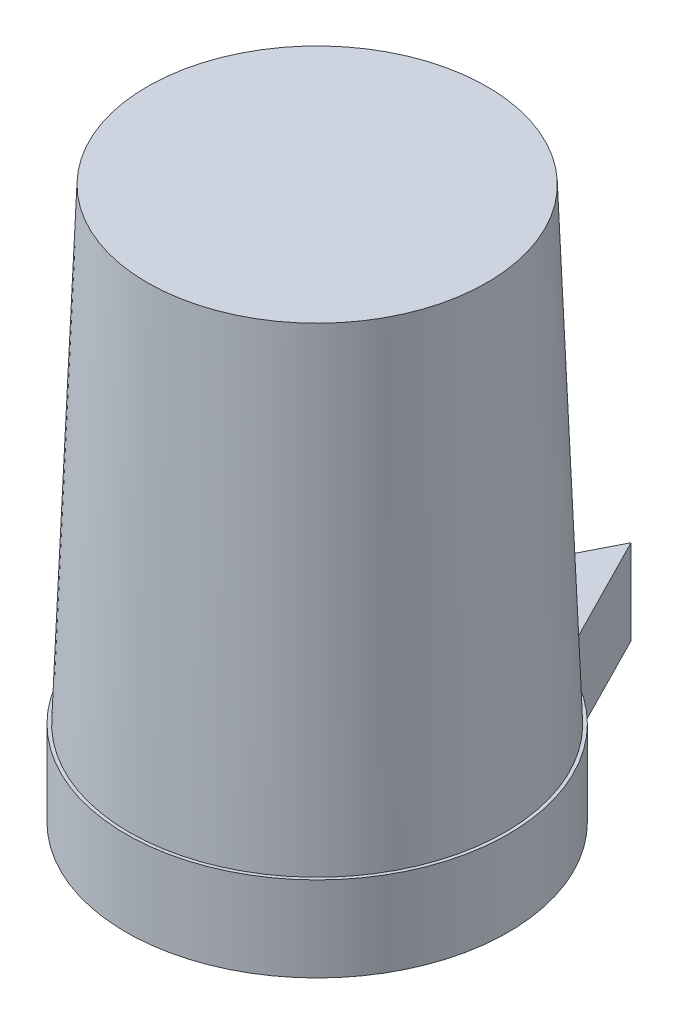
ISO-10303-21;
HEADER;
FILE_DESCRIPTION(('STEP AP214'),'2;1');
FILE_NAME('part.step','',(''),(''),'','','');
FILE_SCHEMA(('AUTOMOTIVE_DESIGN { 1 0 10303 214 1 1 1 1 }'));
ENDSEC;
DATA;
#1=APPLICATION_CONTEXT('core data for automotive mechanical design processes');
#2=APPLICATION_PROTOCOL_DEFINITION('international standard','automotive_design',2000,#1);
#3=PRODUCT_CONTEXT('',#1,'mechanical');
#4=PRODUCT('Part','Part','',(#3));
#5=PRODUCT_RELATED_PRODUCT_CATEGORY('part','',(#4));
#6=PRODUCT_DEFINITION_FORMATION('','',#4);
#7=PRODUCT_DEFINITION_CONTEXT('part definition',#1,'design');
#8=PRODUCT_DEFINITION('design','',#6,#7);
#9=PRODUCT_DEFINITION_SHAPE('','',#8);
#10=(LENGTH_UNIT() NAMED_UNIT(*) SI_UNIT(.MILLI.,.METRE.));
#11=(NAMED_UNIT(*) PLANE_ANGLE_UNIT() SI_UNIT($,.RADIAN.));
#12=(NAMED_UNIT(*) SI_UNIT($,.STERADIAN.) SOLID_ANGLE_UNIT());
#13=UNCERTAINTY_MEASURE_WITH_UNIT(LENGTH_MEASURE(1.E-05),#10,'distance_accuracy_value','');
#14=(GEOMETRIC_REPRESENTATION_CONTEXT(3) GLOBAL_UNCERTAINTY_ASSIGNED_CONTEXT((#13)) GLOBAL_UNIT_ASSIGNED_CONTEXT((#10,
#11,#12)) REPRESENTATION_CONTEXT('',''));
#15=CARTESIAN_POINT('',(0.,0.,0.));
#16=DIRECTION('',(0.,0.,1.));
#17=DIRECTION('',(1.,0.,0.));
#18=AXIS2_PLACEMENT_3D('',#15,#16,#17);
#19=CARTESIAN_POINT('',(0.,0.,0.));
#20=DIRECTION('',(0.,1.,0.));
#21=DIRECTION('',(0.,0.,1.));
#22=AXIS2_PLACEMENT_3D('',#19,#20,#21);
#23=PLANE('',#22);
#24=DIRECTION('',(1.,0.,0.));
#25=VECTOR('',#24,1.);
#26=CARTESIAN_POINT('',(0.,0.,-0.4));
#27=LINE('',#26,#25);
#28=CARTESIAN_POINT('',(-3.47706773014274,0.,-0.4));
#29=VERTEX_POINT('',#28);
#30=CARTESIAN_POINT('',(3.47706773014274,0.,-0.4));
#31=VERTEX_POINT('',#30);
#32=EDGE_CURVE('E61',#29,#31,#27,.T.);
#33=ORIENTED_EDGE('',*,*,#32,.T.);
#34=CARTESIAN_POINT('',(0.,0.,0.));
#35=DIRECTION('',(0.,1.,0.));
#36=DIRECTION('',(0.,0.,1.));
#37=AXIS2_PLACEMENT_3D('',#34,#35,#36);
#38=CIRCLE('',#37,3.5);
#39=EDGE_CURVE('E125',#31,#29,#38,.T.);
#40=ORIENTED_EDGE('',*,*,#39,.T.);
#41=EDGE_LOOP('',(#33,#40));
#42=FACE_BOUND('',#41,.T.);
#43=CARTESIAN_POINT('',(0.,0.,0.));
#44=DIRECTION('',(0.,1.,0.));
#45=DIRECTION('',(0.,0.,1.));
#46=AXIS2_PLACEMENT_3D('',#43,#44,#45);
#47=CIRCLE('',#46,4.5);
#48=CARTESIAN_POINT('',(-1.62629018955969,0.,-4.19585639399889));
#49=VERTEX_POINT('',#48);
#50=CARTESIAN_POINT('',(1.62628895832611,0.,-4.19585321764556));
#51=VERTEX_POINT('',#50);
#52=EDGE_CURVE('E151',#49,#51,#47,.T.);
#53=ORIENTED_EDGE('',*,*,#52,.F.);
#54=DIRECTION('',(0.453423096994453,0.,-0.891295402833404));
#55=VECTOR('',#54,1.);
#56=CARTESIAN_POINT('',(-2.98762275423245,0.,-1.51987450801244));
#57=LINE('',#56,#55);
#58=CARTESIAN_POINT('',(0.,0.,-7.39265523731092));
#59=VERTEX_POINT('',#58);
#60=EDGE_CURVE('E106',#49,#59,#57,.T.);
#61=ORIENTED_EDGE('',*,*,#60,.T.);
#62=DIRECTION('',(-0.453423096994453,0.,-0.891295402833404));
#63=VECTOR('',#62,1.);
#64=CARTESIAN_POINT('',(2.98762275423245,0.,-1.51987450801244));
#65=LINE('',#64,#63);
#66=EDGE_CURVE('E137',#51,#59,#65,.T.);
#67=ORIENTED_EDGE('',*,*,#66,.F.);
#68=EDGE_LOOP('',(#53,#61,#67));
#69=FACE_BOUND('',#68,.T.);
#70=CARTESIAN_POINT('',(0.,0.,0.));
#71=DIRECTION('',(0.,1.,0.));
#72=DIRECTION('',(0.,0.,1.));
#73=AXIS2_PLACEMENT_3D('',#70,#71,#72);
#74=CIRCLE('',#73,3.5);
#75=CARTESIAN_POINT('',(-3.47706773014274,0.,0.4));
#76=VERTEX_POINT('',#75);
#77=CARTESIAN_POINT('',(3.47706773014274,0.,0.4));
#78=VERTEX_POINT('',#77);
#79=EDGE_CURVE('E104',#76,#78,#74,.T.);
#80=ORIENTED_EDGE('',*,*,#79,.T.);
#81=DIRECTION('',(1.,0.,0.));
#82=VECTOR('',#81,1.);
#83=CARTESIAN_POINT('',(0.,0.,0.4));
#84=LINE('',#83,#82);
#85=EDGE_CURVE('E53',#76,#78,#84,.T.);
#86=ORIENTED_EDGE('',*,*,#85,.F.);
#87=EDGE_LOOP('',(#80,#86));
#88=FACE_BOUND('',#87,.T.);
#89=ADVANCED_FACE('F37',(#42,#69,#88),#23,.F.);
#90=CARTESIAN_POINT('',(0.,13.,0.));
#91=DIRECTION('',(0.,1.,0.));
#92=DIRECTION('',(0.,0.,1.));
#93=AXIS2_PLACEMENT_3D('',#90,#91,#92);
#94=PLANE('',#93);
#95=CARTESIAN_POINT('',(0.,13.,0.));
#96=DIRECTION('',(0.,1.,0.));
#97=DIRECTION('',(0.,0.,1.));
#98=AXIS2_PLACEMENT_3D('',#95,#96,#97);
#99=CIRCLE('',#98,4.);
#100=CARTESIAN_POINT('',(0.,13.,4.));
#101=VERTEX_POINT('',#100);
#102=EDGE_CURVE('E45',#101,#101,#99,.T.);
#103=ORIENTED_EDGE('',*,*,#102,.T.);
#104=EDGE_LOOP('',(#103));
#105=FACE_BOUND('',#104,.T.);
#106=ADVANCED_FACE('F180',(#105),#94,.T.);
#107=CARTESIAN_POINT('',(0.,13.,0.));
#108=DIRECTION('',(0.,-1.,0.));
#109=DIRECTION('',(0.,0.,-1.));
#110=AXIS2_PLACEMENT_3D('',#107,#108,#109);
#111=CONICAL_SURFACE('',#110,4.,0.038442590021188);
#112=CARTESIAN_POINT('',(0.,2.,0.));
#113=DIRECTION('',(0.,1.,0.));
#114=DIRECTION('',(0.,0.,1.));
#115=AXIS2_PLACEMENT_3D('',#112,#113,#114);
#116=CIRCLE('',#115,4.42307692307692);
#117=CARTESIAN_POINT('',(0.,2.,4.42307692307692));
#118=VERTEX_POINT('',#117);
#119=EDGE_CURVE('E12',#118,#118,#116,.F.);
#120=ORIENTED_EDGE('',*,*,#119,.F.);
#121=EDGE_LOOP('',(#120));
#122=FACE_BOUND('',#121,.T.);
#123=ORIENTED_EDGE('',*,*,#102,.F.);
#124=EDGE_LOOP('',(#123));
#125=FACE_BOUND('',#124,.T.);
#126=ADVANCED_FACE('F170',(#122,#125),#111,.T.);
#127=CARTESIAN_POINT('',(-2.98762275423245,2.,-1.51987450801244));
#128=DIRECTION('',(-0.891295402833404,0.,-0.453423096994453));
#129=DIRECTION('',(-0.453423096994453,0.,0.891295402833404));
#130=AXIS2_PLACEMENT_3D('',#127,#128,#129);
#131=PLANE('',#130);
#132=ORIENTED_EDGE('',*,*,#60,.F.);
#133=DIRECTION('',(0.,-1.,0.));
#134=VECTOR('',#133,1.);
#135=CARTESIAN_POINT('',(-1.62628895832611,2.,-4.19585321764556));
#136=LINE('',#135,#134);
#137=CARTESIAN_POINT('',(-1.62628895832611,2.,-4.19585321764556));
#138=VERTEX_POINT('',#137);
#139=EDGE_CURVE('E144',#138,#49,#136,.T.);
#140=ORIENTED_EDGE('',*,*,#139,.F.);
#141=DIRECTION('',(0.453423096994453,0.,-0.891295402833404));
#142=VECTOR('',#141,1.);
#143=CARTESIAN_POINT('',(-2.98762275423245,2.,-1.51987450801244));
#144=LINE('',#143,#142);
#145=CARTESIAN_POINT('',(0.,2.,-7.39265523731092));
#146=VERTEX_POINT('',#145);
#147=EDGE_CURVE('E133',#138,#146,#144,.T.);
#148=ORIENTED_EDGE('',*,*,#147,.T.);
#149=DIRECTION('',(0.,-1.,0.));
#150=VECTOR('',#149,1.);
#151=CARTESIAN_POINT('',(0.,2.,-7.39265523731092));
#152=LINE('',#151,#150);
#153=EDGE_CURVE('E141',#146,#59,#152,.T.);
#154=ORIENTED_EDGE('',*,*,#153,.T.);
#155=EDGE_LOOP('',(#132,#140,#148,#154));
#156=FACE_BOUND('',#155,.T.);
#157=ADVANCED_FACE('F179',(#156),#131,.T.);
#158=CARTESIAN_POINT('',(0.,2.,0.));
#159=DIRECTION('',(0.,-1.,0.));
#160=DIRECTION('',(0.,0.,-1.));
#161=AXIS2_PLACEMENT_3D('',#158,#159,#160);
#162=CYLINDRICAL_SURFACE('',#161,4.5);
#163=ORIENTED_EDGE('',*,*,#52,.T.);
#164=DIRECTION('',(0.,-1.,0.));
#165=VECTOR('',#164,1.);
#166=CARTESIAN_POINT('',(1.62628895832611,2.,-4.19585321764556));
#167=LINE('',#166,#165);
#168=CARTESIAN_POINT('',(1.62628895832611,2.,-4.19585321764556));
#169=VERTEX_POINT('',#168);
#170=EDGE_CURVE('E143',#169,#51,#167,.T.);
#171=ORIENTED_EDGE('',*,*,#170,.F.);
#172=CARTESIAN_POINT('',(0.,2.,0.));
#173=DIRECTION('',(0.,1.,0.));
#174=DIRECTION('',(0.,0.,1.));
#175=AXIS2_PLACEMENT_3D('',#172,#173,#174);
#176=CIRCLE('',#175,4.5);
#177=EDGE_CURVE('E136',#138,#169,#176,.T.);
#178=ORIENTED_EDGE('',*,*,#177,.F.);
#179=ORIENTED_EDGE('',*,*,#139,.T.);
#180=EDGE_LOOP('',(#163,#171,#178,#179));
#181=FACE_BOUND('',#180,.T.);
#182=ADVANCED_FACE('F199',(#181),#162,.T.);
#183=CARTESIAN_POINT('',(2.98762275423245,2.,-1.51987450801244));
#184=DIRECTION('',(-0.891295402833404,0.,0.453423096994453));
#185=DIRECTION('',(0.453423096994453,0.,0.891295402833404));
#186=AXIS2_PLACEMENT_3D('',#183,#184,#185);
#187=PLANE('',#186);
#188=ORIENTED_EDGE('',*,*,#66,.T.);
#189=ORIENTED_EDGE('',*,*,#153,.F.);
#190=DIRECTION('',(-0.453423096994453,0.,-0.891295402833404));
#191=VECTOR('',#190,1.);
#192=CARTESIAN_POINT('',(2.98762275423245,2.,-1.51987450801244));
#193=LINE('',#192,#191);
#194=EDGE_CURVE('E139',#169,#146,#193,.T.);
#195=ORIENTED_EDGE('',*,*,#194,.F.);
#196=ORIENTED_EDGE('',*,*,#170,.T.);
#197=EDGE_LOOP('',(#188,#189,#195,#196));
#198=FACE_BOUND('',#197,.T.);
#199=ADVANCED_FACE('F206',(#198),#187,.F.);
#200=CARTESIAN_POINT('',(0.,2.,0.));
#201=DIRECTION('',(0.,1.,0.));
#202=DIRECTION('',(0.,0.,1.));
#203=AXIS2_PLACEMENT_3D('',#200,#201,#202);
#204=PLANE('',#203);
#205=ORIENTED_EDGE('',*,*,#119,.T.);
#206=EDGE_LOOP('',(#205));
#207=FACE_BOUND('',#206,.T.);
#208=ORIENTED_EDGE('',*,*,#147,.F.);
#209=ORIENTED_EDGE('',*,*,#177,.T.);
#210=ORIENTED_EDGE('',*,*,#194,.T.);
#211=EDGE_LOOP('',(#208,#209,#210));
#212=FACE_BOUND('',#211,.T.);
#213=ADVANCED_FACE('F212',(#207,#212),#204,.T.);
#214=CARTESIAN_POINT('',(0.,10.,-0.4));
#215=DIRECTION('',(0.,0.,-1.));
#216=DIRECTION('',(-1.,0.,0.));
#217=AXIS2_PLACEMENT_3D('',#214,#215,#216);
#218=PLANE('',#217);
#219=ORIENTED_EDGE('',*,*,#32,.F.);
#220=DIRECTION('',(0.,-1.,0.));
#221=VECTOR('',#220,1.);
#222=CARTESIAN_POINT('',(-3.47706773014274,10.,-0.4));
#223=LINE('',#222,#221);
#224=CARTESIAN_POINT('',(-3.47706773014274,10.,-0.4));
#225=VERTEX_POINT('',#224);
#226=EDGE_CURVE('E127',#225,#29,#223,.T.);
#227=ORIENTED_EDGE('',*,*,#226,.F.);
#228=DIRECTION('',(1.,0.,0.));
#229=VECTOR('',#228,1.);
#230=CARTESIAN_POINT('',(0.,10.,-0.4));
#231=LINE('',#230,#229);
#232=CARTESIAN_POINT('',(3.47706773014274,10.,-0.4));
#233=VERTEX_POINT('',#232);
#234=EDGE_CURVE('E121',#225,#233,#231,.T.);
#235=ORIENTED_EDGE('',*,*,#234,.T.);
#236=DIRECTION('',(0.,-1.,0.));
#237=VECTOR('',#236,1.);
#238=CARTESIAN_POINT('',(3.47706773014274,10.,-0.4));
#239=LINE('',#238,#237);
#240=EDGE_CURVE('E118',#233,#31,#239,.T.);
#241=ORIENTED_EDGE('',*,*,#240,.T.);
#242=EDGE_LOOP('',(#219,#227,#235,#241));
#243=FACE_BOUND('',#242,.T.);
#244=ADVANCED_FACE('F214',(#243),#218,.T.);
#245=CARTESIAN_POINT('',(0.,10.,0.));
#246=DIRECTION('',(0.,-1.,0.));
#247=DIRECTION('',(0.,0.,-1.));
#248=AXIS2_PLACEMENT_3D('',#245,#246,#247);
#249=CYLINDRICAL_SURFACE('',#248,3.5);
#250=ORIENTED_EDGE('',*,*,#39,.F.);
#251=ORIENTED_EDGE('',*,*,#240,.F.);
#252=CARTESIAN_POINT('',(0.,10.,0.));
#253=DIRECTION('',(0.,1.,0.));
#254=DIRECTION('',(0.,0.,1.));
#255=AXIS2_PLACEMENT_3D('',#252,#253,#254);
#256=CIRCLE('',#255,3.5);
#257=EDGE_CURVE('E124',#233,#225,#256,.T.);
#258=ORIENTED_EDGE('',*,*,#257,.T.);
#259=ORIENTED_EDGE('',*,*,#226,.T.);
#260=EDGE_LOOP('',(#250,#251,#258,#259));
#261=FACE_BOUND('',#260,.T.);
#262=ADVANCED_FACE('F221',(#261),#249,.F.);
#263=CARTESIAN_POINT('',(0.,10.,0.));
#264=DIRECTION('',(0.,1.,0.));
#265=DIRECTION('',(0.,0.,1.));
#266=AXIS2_PLACEMENT_3D('',#263,#264,#265);
#267=PLANE('',#266);
#268=ORIENTED_EDGE('',*,*,#234,.F.);
#269=ORIENTED_EDGE('',*,*,#257,.F.);
#270=EDGE_LOOP('',(#268,#269));
#271=FACE_BOUND('',#270,.T.);
#272=ADVANCED_FACE('F232',(#271),#267,.F.);
#273=CARTESIAN_POINT('',(0.,10.,0.4));
#274=DIRECTION('',(0.,0.,-1.));
#275=DIRECTION('',(-1.,0.,0.));
#276=AXIS2_PLACEMENT_3D('',#273,#274,#275);
#277=PLANE('',#276);
#278=ORIENTED_EDGE('',*,*,#85,.T.);
#279=DIRECTION('',(0.,-1.,0.));
#280=VECTOR('',#279,1.);
#281=CARTESIAN_POINT('',(3.47706773014274,10.,0.4));
#282=LINE('',#281,#280);
#283=CARTESIAN_POINT('',(3.47706773014274,10.,0.4));
#284=VERTEX_POINT('',#283);
#285=EDGE_CURVE('E107',#284,#78,#282,.T.);
#286=ORIENTED_EDGE('',*,*,#285,.F.);
#287=DIRECTION('',(1.,0.,0.));
#288=VECTOR('',#287,1.);
#289=CARTESIAN_POINT('',(0.,10.,0.4));
#290=LINE('',#289,#288);
#291=CARTESIAN_POINT('',(-3.47706773014274,10.,0.4));
#292=VERTEX_POINT('',#291);
#293=EDGE_CURVE('E112',#292,#284,#290,.T.);
#294=ORIENTED_EDGE('',*,*,#293,.F.);
#295=DIRECTION('',(0.,-1.,0.));
#296=VECTOR('',#295,1.);
#297=CARTESIAN_POINT('',(-3.47706773014274,10.,0.4));
#298=LINE('',#297,#296);
#299=EDGE_CURVE('E99',#292,#76,#298,.T.);
#300=ORIENTED_EDGE('',*,*,#299,.T.);
#301=EDGE_LOOP('',(#278,#286,#294,#300));
#302=FACE_BOUND('',#301,.T.);
#303=ADVANCED_FACE('F114',(#302),#277,.F.);
#304=CARTESIAN_POINT('',(0.,10.,0.));
#305=DIRECTION('',(0.,-1.,0.));
#306=DIRECTION('',(0.,0.,-1.));
#307=AXIS2_PLACEMENT_3D('',#304,#305,#306);
#308=CYLINDRICAL_SURFACE('',#307,3.5);
#309=ORIENTED_EDGE('',*,*,#79,.F.);
#310=ORIENTED_EDGE('',*,*,#299,.F.);
#311=CARTESIAN_POINT('',(0.,10.,0.));
#312=DIRECTION('',(0.,1.,0.));
#313=DIRECTION('',(0.,0.,1.));
#314=AXIS2_PLACEMENT_3D('',#311,#312,#313);
#315=CIRCLE('',#314,3.5);
#316=EDGE_CURVE('E102',#292,#284,#315,.T.);
#317=ORIENTED_EDGE('',*,*,#316,.T.);
#318=ORIENTED_EDGE('',*,*,#285,.T.);
#319=EDGE_LOOP('',(#309,#310,#317,#318));
#320=FACE_BOUND('',#319,.T.);
#321=ADVANCED_FACE('F101',(#320),#308,.F.);
#322=CARTESIAN_POINT('',(0.,10.,0.));
#323=DIRECTION('',(0.,1.,0.));
#324=DIRECTION('',(0.,0.,1.));
#325=AXIS2_PLACEMENT_3D('',#322,#323,#324);
#326=PLANE('',#325);
#327=ORIENTED_EDGE('',*,*,#293,.T.);
#328=ORIENTED_EDGE('',*,*,#316,.F.);
#329=EDGE_LOOP('',(#327,#328));
#330=FACE_BOUND('',#329,.T.);
#331=ADVANCED_FACE('F111',(#330),#326,.F.);
#332=CLOSED_SHELL('',(#89,#106,#126,#157,#182,#199,#213,#244,#262,#272,#303,#321,#331));
#333=MANIFOLD_SOLID_BREP('B2',#332);
#334=ADVANCED_BREP_SHAPE_REPRESENTATION('',(#18,#333),#14);
#335=SHAPE_DEFINITION_REPRESENTATION(#9,#334);
ENDSEC;
END-ISO-10303-21;
